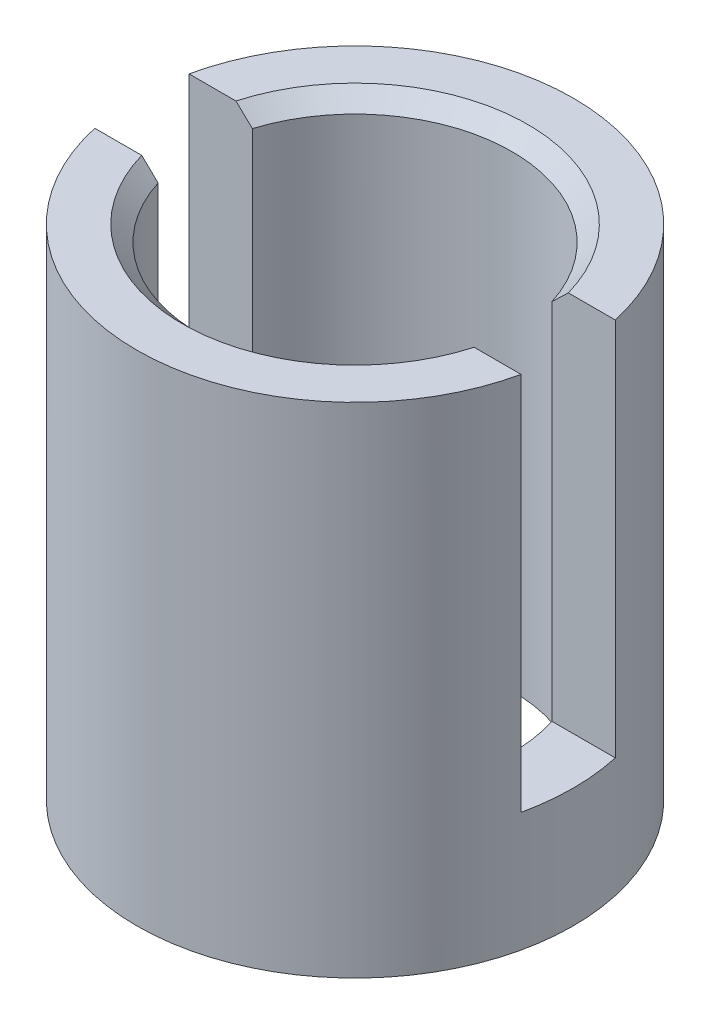
ISO-10303-21;
HEADER;
FILE_DESCRIPTION(('STEP AP214'),'2;1');
FILE_NAME('part.step','',(''),(''),'','','');
FILE_SCHEMA(('AUTOMOTIVE_DESIGN { 1 0 10303 214 1 1 1 1 }'));
ENDSEC;
DATA;
#1=APPLICATION_CONTEXT('core data for automotive mechanical design processes');
#2=APPLICATION_PROTOCOL_DEFINITION('international standard','automotive_design',2000,#1);
#3=PRODUCT_CONTEXT('',#1,'mechanical');
#4=PRODUCT('Part','Part','',(#3));
#5=PRODUCT_RELATED_PRODUCT_CATEGORY('part','',(#4));
#6=PRODUCT_DEFINITION_FORMATION('','',#4);
#7=PRODUCT_DEFINITION_CONTEXT('part definition',#1,'design');
#8=PRODUCT_DEFINITION('design','',#6,#7);
#9=PRODUCT_DEFINITION_SHAPE('','',#8);
#10=(LENGTH_UNIT() NAMED_UNIT(*) SI_UNIT(.MILLI.,.METRE.));
#11=(NAMED_UNIT(*) PLANE_ANGLE_UNIT() SI_UNIT($,.RADIAN.));
#12=(NAMED_UNIT(*) SI_UNIT($,.STERADIAN.) SOLID_ANGLE_UNIT());
#13=UNCERTAINTY_MEASURE_WITH_UNIT(LENGTH_MEASURE(1.E-05),#10,'distance_accuracy_value','');
#14=(GEOMETRIC_REPRESENTATION_CONTEXT(3) GLOBAL_UNCERTAINTY_ASSIGNED_CONTEXT((#13)) GLOBAL_UNIT_ASSIGNED_CONTEXT((#10,
#11,#12)) REPRESENTATION_CONTEXT('',''));
#15=CARTESIAN_POINT('',(0.,0.,0.));
#16=DIRECTION('',(0.,0.,1.));
#17=DIRECTION('',(1.,0.,0.));
#18=AXIS2_PLACEMENT_3D('',#15,#16,#17);
#19=CARTESIAN_POINT('',(0.,6.35,0.));
#20=DIRECTION('',(0.,1.,0.));
#21=DIRECTION('',(0.,0.,1.));
#22=AXIS2_PLACEMENT_3D('',#19,#20,#21);
#23=PLANE('',#22);
#24=DIRECTION('',(-1.,0.,0.));
#25=VECTOR('',#24,1.);
#26=CARTESIAN_POINT('',(-2.71447969231674,6.35,-0.6));
#27=LINE('',#26,#25);
#28=CARTESIAN_POINT('',(-2.11660104885167,6.35,-0.6));
#29=VERTEX_POINT('',#28);
#30=CARTESIAN_POINT('',(-2.71447969231674,6.35,-0.6));
#31=VERTEX_POINT('',#30);
#32=EDGE_CURVE('E230',#29,#31,#27,.T.);
#33=ORIENTED_EDGE('',*,*,#32,.F.);
#34=CARTESIAN_POINT('',(0.,6.35,0.));
#35=DIRECTION('',(0.,1.,0.));
#36=DIRECTION('',(0.,0.,1.));
#37=AXIS2_PLACEMENT_3D('',#34,#35,#36);
#38=CIRCLE('',#37,2.2);
#39=CARTESIAN_POINT('',(2.11660104885167,6.35,-0.6));
#40=VERTEX_POINT('',#39);
#41=EDGE_CURVE('E183',#29,#40,#38,.F.);
#42=ORIENTED_EDGE('',*,*,#41,.T.);
#43=CARTESIAN_POINT('',(2.71447969231674,6.35,-0.6));
#44=VERTEX_POINT('',#43);
#45=EDGE_CURVE('E131',#44,#40,#27,.T.);
#46=ORIENTED_EDGE('',*,*,#45,.F.);
#47=CARTESIAN_POINT('',(0.,6.35,0.));
#48=DIRECTION('',(0.,1.,0.));
#49=DIRECTION('',(0.,0.,1.));
#50=AXIS2_PLACEMENT_3D('',#47,#48,#49);
#51=CIRCLE('',#50,2.78);
#52=EDGE_CURVE('E150',#44,#31,#51,.T.);
#53=ORIENTED_EDGE('',*,*,#52,.T.);
#54=EDGE_LOOP('',(#33,#42,#46,#53));
#55=FACE_BOUND('',#54,.T.);
#56=ADVANCED_FACE('F34',(#55),#23,.T.);
#57=DIRECTION('',(1.,0.,0.));
#58=VECTOR('',#57,1.);
#59=CARTESIAN_POINT('',(-2.71447969231674,6.35,0.6));
#60=LINE('',#59,#58);
#61=CARTESIAN_POINT('',(2.11660104885167,6.35,0.6));
#62=VERTEX_POINT('',#61);
#63=CARTESIAN_POINT('',(2.71447969231674,6.35,0.6));
#64=VERTEX_POINT('',#63);
#65=EDGE_CURVE('E231',#62,#64,#60,.T.);
#66=ORIENTED_EDGE('',*,*,#65,.F.);
#67=CARTESIAN_POINT('',(0.,6.35,0.));
#68=DIRECTION('',(0.,1.,0.));
#69=DIRECTION('',(0.,0.,1.));
#70=AXIS2_PLACEMENT_3D('',#67,#68,#69);
#71=CIRCLE('',#70,2.2);
#72=CARTESIAN_POINT('',(-2.11660104885167,6.35,0.6));
#73=VERTEX_POINT('',#72);
#74=EDGE_CURVE('E49',#62,#73,#71,.F.);
#75=ORIENTED_EDGE('',*,*,#74,.T.);
#76=CARTESIAN_POINT('',(-2.71447969231674,6.35,0.6));
#77=VERTEX_POINT('',#76);
#78=EDGE_CURVE('E220',#77,#73,#60,.T.);
#79=ORIENTED_EDGE('',*,*,#78,.F.);
#80=EDGE_CURVE('E139',#77,#64,#51,.T.);
#81=ORIENTED_EDGE('',*,*,#80,.T.);
#82=EDGE_LOOP('',(#66,#75,#79,#81));
#83=FACE_BOUND('',#82,.T.);
#84=ADVANCED_FACE('F251',(#83),#23,.T.);
#85=CARTESIAN_POINT('',(0.,0.,0.));
#86=DIRECTION('',(0.,1.,0.));
#87=DIRECTION('',(0.,0.,1.));
#88=AXIS2_PLACEMENT_3D('',#85,#86,#87);
#89=PLANE('',#88);
#90=CARTESIAN_POINT('',(0.,0.,0.));
#91=DIRECTION('',(0.,1.,0.));
#92=DIRECTION('',(0.,0.,1.));
#93=AXIS2_PLACEMENT_3D('',#90,#91,#92);
#94=CIRCLE('',#93,2.2);
#95=CARTESIAN_POINT('',(0.,0.,2.2));
#96=VERTEX_POINT('',#95);
#97=EDGE_CURVE('E11',#96,#96,#94,.T.);
#98=ORIENTED_EDGE('',*,*,#97,.T.);
#99=EDGE_LOOP('',(#98));
#100=FACE_BOUND('',#99,.T.);
#101=CARTESIAN_POINT('',(0.,0.,0.));
#102=DIRECTION('',(0.,1.,0.));
#103=DIRECTION('',(0.,0.,1.));
#104=AXIS2_PLACEMENT_3D('',#101,#102,#103);
#105=CIRCLE('',#104,2.78);
#106=CARTESIAN_POINT('',(0.,0.,2.78));
#107=VERTEX_POINT('',#106);
#108=EDGE_CURVE('E151',#107,#107,#105,.T.);
#109=ORIENTED_EDGE('',*,*,#108,.F.);
#110=EDGE_LOOP('',(#109));
#111=FACE_BOUND('',#110,.T.);
#112=ADVANCED_FACE('F253',(#100,#111),#89,.F.);
#113=CARTESIAN_POINT('',(0.,6.35,0.));
#114=DIRECTION('',(0.,-1.,0.));
#115=DIRECTION('',(0.,0.,-1.));
#116=AXIS2_PLACEMENT_3D('',#113,#114,#115);
#117=CYLINDRICAL_SURFACE('',#116,2.78);
#118=ORIENTED_EDGE('',*,*,#52,.F.);
#119=DIRECTION('',(0.,1.,0.));
#120=VECTOR('',#119,1.);
#121=CARTESIAN_POINT('',(2.71447969231674,1.52,-0.6));
#122=LINE('',#121,#120);
#123=CARTESIAN_POINT('',(2.71447969231674,1.52,-0.6));
#124=VERTEX_POINT('',#123);
#125=EDGE_CURVE('E143',#124,#44,#122,.T.);
#126=ORIENTED_EDGE('',*,*,#125,.F.);
#127=CARTESIAN_POINT('',(0.,1.52,0.));
#128=DIRECTION('',(0.,1.,0.));
#129=DIRECTION('',(0.,0.,1.));
#130=AXIS2_PLACEMENT_3D('',#127,#128,#129);
#131=CIRCLE('',#130,2.78);
#132=CARTESIAN_POINT('',(2.71447969231674,1.52,0.6));
#133=VERTEX_POINT('',#132);
#134=EDGE_CURVE('E120',#133,#124,#131,.T.);
#135=ORIENTED_EDGE('',*,*,#134,.F.);
#136=DIRECTION('',(0.,1.,0.));
#137=VECTOR('',#136,1.);
#138=CARTESIAN_POINT('',(2.71447969231674,1.52,0.6));
#139=LINE('',#138,#137);
#140=EDGE_CURVE('E140',#133,#64,#139,.T.);
#141=ORIENTED_EDGE('',*,*,#140,.T.);
#142=ORIENTED_EDGE('',*,*,#80,.F.);
#143=DIRECTION('',(0.,1.,0.));
#144=VECTOR('',#143,1.);
#145=CARTESIAN_POINT('',(-2.71447969231674,1.52,0.6));
#146=LINE('',#145,#144);
#147=CARTESIAN_POINT('',(-2.71447969231674,1.52,0.6));
#148=VERTEX_POINT('',#147);
#149=EDGE_CURVE('E115',#148,#77,#146,.T.);
#150=ORIENTED_EDGE('',*,*,#149,.F.);
#151=CARTESIAN_POINT('',(0.,1.52,0.));
#152=DIRECTION('',(0.,1.,0.));
#153=DIRECTION('',(0.,0.,1.));
#154=AXIS2_PLACEMENT_3D('',#151,#152,#153);
#155=CIRCLE('',#154,2.78);
#156=CARTESIAN_POINT('',(-2.71447969231674,1.52,-0.6));
#157=VERTEX_POINT('',#156);
#158=EDGE_CURVE('E124',#157,#148,#155,.T.);
#159=ORIENTED_EDGE('',*,*,#158,.F.);
#160=DIRECTION('',(0.,1.,0.));
#161=VECTOR('',#160,1.);
#162=CARTESIAN_POINT('',(-2.71447969231674,1.52,-0.6));
#163=LINE('',#162,#161);
#164=EDGE_CURVE('E154',#157,#31,#163,.T.);
#165=ORIENTED_EDGE('',*,*,#164,.T.);
#166=EDGE_LOOP('',(#118,#126,#135,#141,#142,#150,#159,#165));
#167=FACE_BOUND('',#166,.T.);
#168=ORIENTED_EDGE('',*,*,#108,.T.);
#169=EDGE_LOOP('',(#168));
#170=FACE_BOUND('',#169,.T.);
#171=ADVANCED_FACE('F135',(#167,#170),#117,.T.);
#172=CARTESIAN_POINT('',(0.,6.35,0.));
#173=DIRECTION('',(0.,-1.,0.));
#174=DIRECTION('',(0.,0.,-1.));
#175=AXIS2_PLACEMENT_3D('',#172,#173,#174);
#176=CYLINDRICAL_SURFACE('',#175,2.);
#177=CARTESIAN_POINT('',(0.,0.200000000000001,0.));
#178=DIRECTION('',(0.,1.,0.));
#179=DIRECTION('',(0.,0.,1.));
#180=AXIS2_PLACEMENT_3D('',#177,#178,#179);
#181=CIRCLE('',#180,2.);
#182=CARTESIAN_POINT('',(0.,0.200000000000001,2.));
#183=VERTEX_POINT('',#182);
#184=EDGE_CURVE('E166',#183,#183,#181,.F.);
#185=ORIENTED_EDGE('',*,*,#184,.T.);
#186=EDGE_LOOP('',(#185));
#187=FACE_BOUND('',#186,.T.);
#188=DIRECTION('',(0.,-1.,0.));
#189=VECTOR('',#188,1.);
#190=CARTESIAN_POINT('',(1.90787840283389,6.35,-0.6));
#191=LINE('',#190,#189);
#192=CARTESIAN_POINT('',(1.90787840283389,6.15,-0.6));
#193=VERTEX_POINT('',#192);
#194=CARTESIAN_POINT('',(1.90787840283389,1.52,-0.6));
#195=VERTEX_POINT('',#194);
#196=EDGE_CURVE('E164',#193,#195,#191,.T.);
#197=ORIENTED_EDGE('',*,*,#196,.F.);
#198=CARTESIAN_POINT('',(0.,6.15,0.));
#199=DIRECTION('',(0.,1.,0.));
#200=DIRECTION('',(0.,0.,1.));
#201=AXIS2_PLACEMENT_3D('',#198,#199,#200);
#202=CIRCLE('',#201,2.);
#203=CARTESIAN_POINT('',(-1.90787840283389,6.15,-0.6));
#204=VERTEX_POINT('',#203);
#205=EDGE_CURVE('E172',#193,#204,#202,.T.);
#206=ORIENTED_EDGE('',*,*,#205,.T.);
#207=DIRECTION('',(0.,-1.,0.));
#208=VECTOR('',#207,1.);
#209=CARTESIAN_POINT('',(-1.90787840283389,6.35,-0.6));
#210=LINE('',#209,#208);
#211=CARTESIAN_POINT('',(-1.90787840283389,1.52,-0.6));
#212=VERTEX_POINT('',#211);
#213=EDGE_CURVE('E159',#212,#204,#210,.F.);
#214=ORIENTED_EDGE('',*,*,#213,.F.);
#215=CARTESIAN_POINT('',(0.,1.52,0.));
#216=DIRECTION('',(0.,1.,0.));
#217=DIRECTION('',(0.,0.,1.));
#218=AXIS2_PLACEMENT_3D('',#215,#216,#217);
#219=CIRCLE('',#218,2.);
#220=CARTESIAN_POINT('',(-1.90787840283389,1.52,0.6));
#221=VERTEX_POINT('',#220);
#222=EDGE_CURVE('E155',#212,#221,#219,.T.);
#223=ORIENTED_EDGE('',*,*,#222,.T.);
#224=DIRECTION('',(0.,-1.,0.));
#225=VECTOR('',#224,1.);
#226=CARTESIAN_POINT('',(-1.90787840283389,6.35,0.6));
#227=LINE('',#226,#225);
#228=CARTESIAN_POINT('',(-1.90787840283389,6.15,0.6));
#229=VERTEX_POINT('',#228);
#230=EDGE_CURVE('E117',#229,#221,#227,.T.);
#231=ORIENTED_EDGE('',*,*,#230,.F.);
#232=CARTESIAN_POINT('',(0.,6.15,0.));
#233=DIRECTION('',(0.,1.,0.));
#234=DIRECTION('',(0.,0.,1.));
#235=AXIS2_PLACEMENT_3D('',#232,#233,#234);
#236=CIRCLE('',#235,2.);
#237=CARTESIAN_POINT('',(1.90787840283389,6.15,0.6));
#238=VERTEX_POINT('',#237);
#239=EDGE_CURVE('E169',#229,#238,#236,.T.);
#240=ORIENTED_EDGE('',*,*,#239,.T.);
#241=DIRECTION('',(0.,-1.,0.));
#242=VECTOR('',#241,1.);
#243=CARTESIAN_POINT('',(1.90787840283389,6.35,0.6));
#244=LINE('',#243,#242);
#245=CARTESIAN_POINT('',(1.90787840283389,1.52,0.6));
#246=VERTEX_POINT('',#245);
#247=EDGE_CURVE('E162',#246,#238,#244,.F.);
#248=ORIENTED_EDGE('',*,*,#247,.F.);
#249=EDGE_CURVE('E157',#246,#195,#219,.T.);
#250=ORIENTED_EDGE('',*,*,#249,.T.);
#251=EDGE_LOOP('',(#197,#206,#214,#223,#231,#240,#248,#250));
#252=FACE_BOUND('',#251,.T.);
#253=ADVANCED_FACE('F224',(#187,#252),#176,.F.);
#254=CARTESIAN_POINT('',(0.,1.52,0.));
#255=DIRECTION('',(0.,1.,0.));
#256=DIRECTION('',(0.,0.,1.));
#257=AXIS2_PLACEMENT_3D('',#254,#255,#256);
#258=PLANE('',#257);
#259=DIRECTION('',(-1.,0.,0.));
#260=VECTOR('',#259,1.);
#261=CARTESIAN_POINT('',(-2.71447969231674,1.52,-0.6));
#262=LINE('',#261,#260);
#263=EDGE_CURVE('E127',#212,#157,#262,.T.);
#264=ORIENTED_EDGE('',*,*,#263,.T.);
#265=ORIENTED_EDGE('',*,*,#158,.T.);
#266=DIRECTION('',(1.,0.,0.));
#267=VECTOR('',#266,1.);
#268=CARTESIAN_POINT('',(-2.71447969231674,1.52,0.6));
#269=LINE('',#268,#267);
#270=EDGE_CURVE('E111',#148,#221,#269,.T.);
#271=ORIENTED_EDGE('',*,*,#270,.T.);
#272=ORIENTED_EDGE('',*,*,#222,.F.);
#273=EDGE_LOOP('',(#264,#265,#271,#272));
#274=FACE_BOUND('',#273,.T.);
#275=ADVANCED_FACE('F125',(#274),#258,.T.);
#276=CARTESIAN_POINT('',(-2.71447969231674,1.52,0.6));
#277=DIRECTION('',(0.,0.,1.));
#278=DIRECTION('',(1.,0.,0.));
#279=AXIS2_PLACEMENT_3D('',#276,#277,#278);
#280=PLANE('',#279);
#281=ORIENTED_EDGE('',*,*,#78,.T.);
#282=CARTESIAN_POINT('',(-2.11660104885167,6.35,0.6));
#283=CARTESIAN_POINT('',(-2.08188461575082,6.31659291347862,0.6));
#284=CARTESIAN_POINT('',(-2.04713284629836,6.28322270444128,0.6));
#285=CARTESIAN_POINT('',(-1.97755863096666,6.21655603776672,0.6));
#286=CARTESIAN_POINT('',(-1.94273618507986,6.1832595801374,0.6));
#287=CARTESIAN_POINT('',(-1.90787840283389,6.15,0.6));
#288=B_SPLINE_CURVE_WITH_KNOTS('',3,(#282,#283,#284,#285,#286,#287),.UNSPECIFIED.,.F.,.F.,(4,2,
4),(0.,0.14453825438774,0.289076524246643),.UNSPECIFIED.);
#289=EDGE_CURVE('E42',#73,#229,#288,.T.);
#290=ORIENTED_EDGE('',*,*,#289,.T.);
#291=ORIENTED_EDGE('',*,*,#230,.T.);
#292=ORIENTED_EDGE('',*,*,#270,.F.);
#293=ORIENTED_EDGE('',*,*,#149,.T.);
#294=EDGE_LOOP('',(#281,#290,#291,#292,#293));
#295=FACE_BOUND('',#294,.T.);
#296=ADVANCED_FACE('F113',(#295),#280,.F.);
#297=CARTESIAN_POINT('',(-2.71447969231674,1.52,-0.6));
#298=DIRECTION('',(0.,0.,-1.));
#299=DIRECTION('',(-1.,0.,0.));
#300=AXIS2_PLACEMENT_3D('',#297,#298,#299);
#301=PLANE('',#300);
#302=ORIENTED_EDGE('',*,*,#213,.T.);
#303=CARTESIAN_POINT('',(-1.90787840283389,6.15,-0.6));
#304=CARTESIAN_POINT('',(-1.94273618507986,6.1832595801374,-0.6));
#305=CARTESIAN_POINT('',(-1.97755863096666,6.21655603776672,-0.6));
#306=CARTESIAN_POINT('',(-2.04713284629836,6.28322270444128,-0.6));
#307=CARTESIAN_POINT('',(-2.08188461575082,6.31659291347862,-0.6));
#308=CARTESIAN_POINT('',(-2.11660104885167,6.35,-0.6));
#309=B_SPLINE_CURVE_WITH_KNOTS('',3,(#303,#304,#305,#306,#307,#308),.UNSPECIFIED.,.F.,.F.,(4,2,
4),(0.,0.144538269858903,0.289076524246644),.UNSPECIFIED.);
#310=EDGE_CURVE('E175',#204,#29,#309,.T.);
#311=ORIENTED_EDGE('',*,*,#310,.T.);
#312=ORIENTED_EDGE('',*,*,#32,.T.);
#313=ORIENTED_EDGE('',*,*,#164,.F.);
#314=ORIENTED_EDGE('',*,*,#263,.F.);
#315=EDGE_LOOP('',(#302,#311,#312,#313,#314));
#316=FACE_BOUND('',#315,.T.);
#317=ADVANCED_FACE('F188',(#316),#301,.F.);
#318=ORIENTED_EDGE('',*,*,#45,.T.);
#319=CARTESIAN_POINT('',(2.11660104885167,6.35,-0.6));
#320=CARTESIAN_POINT('',(2.08188461575082,6.31659291347862,-0.6));
#321=CARTESIAN_POINT('',(2.04713284629836,6.28322270444128,-0.6));
#322=CARTESIAN_POINT('',(1.97755863096666,6.21655603776672,-0.6));
#323=CARTESIAN_POINT('',(1.94273618507986,6.1832595801374,-0.6));
#324=CARTESIAN_POINT('',(1.90787840283389,6.15,-0.6));
#325=B_SPLINE_CURVE_WITH_KNOTS('',3,(#319,#320,#321,#322,#323,#324),.UNSPECIFIED.,.F.,.F.,(4,2,
4),(0.,0.14453825438774,0.289076524246643),.UNSPECIFIED.);
#326=EDGE_CURVE('E199',#40,#193,#325,.T.);
#327=ORIENTED_EDGE('',*,*,#326,.T.);
#328=ORIENTED_EDGE('',*,*,#196,.T.);
#329=EDGE_CURVE('E141',#124,#195,#262,.T.);
#330=ORIENTED_EDGE('',*,*,#329,.F.);
#331=ORIENTED_EDGE('',*,*,#125,.T.);
#332=EDGE_LOOP('',(#318,#327,#328,#330,#331));
#333=FACE_BOUND('',#332,.T.);
#334=ADVANCED_FACE('F193',(#333),#301,.F.);
#335=EDGE_CURVE('E121',#246,#133,#269,.T.);
#336=ORIENTED_EDGE('',*,*,#335,.T.);
#337=ORIENTED_EDGE('',*,*,#134,.T.);
#338=ORIENTED_EDGE('',*,*,#329,.T.);
#339=ORIENTED_EDGE('',*,*,#249,.F.);
#340=EDGE_LOOP('',(#336,#337,#338,#339));
#341=FACE_BOUND('',#340,.T.);
#342=ADVANCED_FACE('F249',(#341),#258,.T.);
#343=ORIENTED_EDGE('',*,*,#247,.T.);
#344=CARTESIAN_POINT('',(1.90787840283389,6.15,0.6));
#345=CARTESIAN_POINT('',(1.94273618507986,6.1832595801374,0.6));
#346=CARTESIAN_POINT('',(1.97755863096666,6.21655603776672,0.6));
#347=CARTESIAN_POINT('',(2.04713284629836,6.28322270444128,0.6));
#348=CARTESIAN_POINT('',(2.08188461575082,6.31659291347862,0.6));
#349=CARTESIAN_POINT('',(2.11660104885167,6.35,0.6));
#350=B_SPLINE_CURVE_WITH_KNOTS('',3,(#344,#345,#346,#347,#348,#349),.UNSPECIFIED.,.F.,.F.,(4,2,
4),(0.,0.144538269858903,0.289076524246644),.UNSPECIFIED.);
#351=EDGE_CURVE('E57',#238,#62,#350,.T.);
#352=ORIENTED_EDGE('',*,*,#351,.T.);
#353=ORIENTED_EDGE('',*,*,#65,.T.);
#354=ORIENTED_EDGE('',*,*,#140,.F.);
#355=ORIENTED_EDGE('',*,*,#335,.F.);
#356=EDGE_LOOP('',(#343,#352,#353,#354,#355));
#357=FACE_BOUND('',#356,.T.);
#358=ADVANCED_FACE('F195',(#357),#280,.F.);
#359=CARTESIAN_POINT('',(0.,6.15,0.));
#360=DIRECTION('',(0.,1.,0.));
#361=DIRECTION('',(0.,0.,1.));
#362=AXIS2_PLACEMENT_3D('',#359,#360,#361);
#363=CONICAL_SURFACE('',#362,2.,0.785398163397453);
#364=ORIENTED_EDGE('',*,*,#326,.F.);
#365=ORIENTED_EDGE('',*,*,#41,.F.);
#366=ORIENTED_EDGE('',*,*,#310,.F.);
#367=ORIENTED_EDGE('',*,*,#205,.F.);
#368=EDGE_LOOP('',(#364,#365,#366,#367));
#369=FACE_BOUND('',#368,.T.);
#370=ADVANCED_FACE('F185',(#369),#363,.F.);
#371=CARTESIAN_POINT('',(0.,6.15,0.));
#372=DIRECTION('',(0.,1.,0.));
#373=DIRECTION('',(0.,0.,1.));
#374=AXIS2_PLACEMENT_3D('',#371,#372,#373);
#375=CONICAL_SURFACE('',#374,2.,0.785398163397453);
#376=ORIENTED_EDGE('',*,*,#289,.F.);
#377=ORIENTED_EDGE('',*,*,#74,.F.);
#378=ORIENTED_EDGE('',*,*,#351,.F.);
#379=ORIENTED_EDGE('',*,*,#239,.F.);
#380=EDGE_LOOP('',(#376,#377,#378,#379));
#381=FACE_BOUND('',#380,.T.);
#382=ADVANCED_FACE('F210',(#381),#375,.F.);
#383=CARTESIAN_POINT('',(0.,0.,0.));
#384=DIRECTION('',(0.,-1.,0.));
#385=DIRECTION('',(0.,0.,-1.));
#386=AXIS2_PLACEMENT_3D('',#383,#384,#385);
#387=CONICAL_SURFACE('',#386,2.2,0.785398163397442);
#388=ORIENTED_EDGE('',*,*,#184,.F.);
#389=EDGE_LOOP('',(#388));
#390=FACE_BOUND('',#389,.T.);
#391=ORIENTED_EDGE('',*,*,#97,.F.);
#392=EDGE_LOOP('',(#391));
#393=FACE_BOUND('',#392,.T.);
#394=ADVANCED_FACE('F36',(#390,#393),#387,.F.);
#395=CLOSED_SHELL('',(#56,#84,#112,#171,#253,#275,#296,#317,#334,#342,#358,#370,#382,#394));
#396=MANIFOLD_SOLID_BREP('B2',#395);
#397=ADVANCED_BREP_SHAPE_REPRESENTATION('',(#18,#396),#14);
#398=SHAPE_DEFINITION_REPRESENTATION(#9,#397);
ENDSEC;
END-ISO-10303-21;
